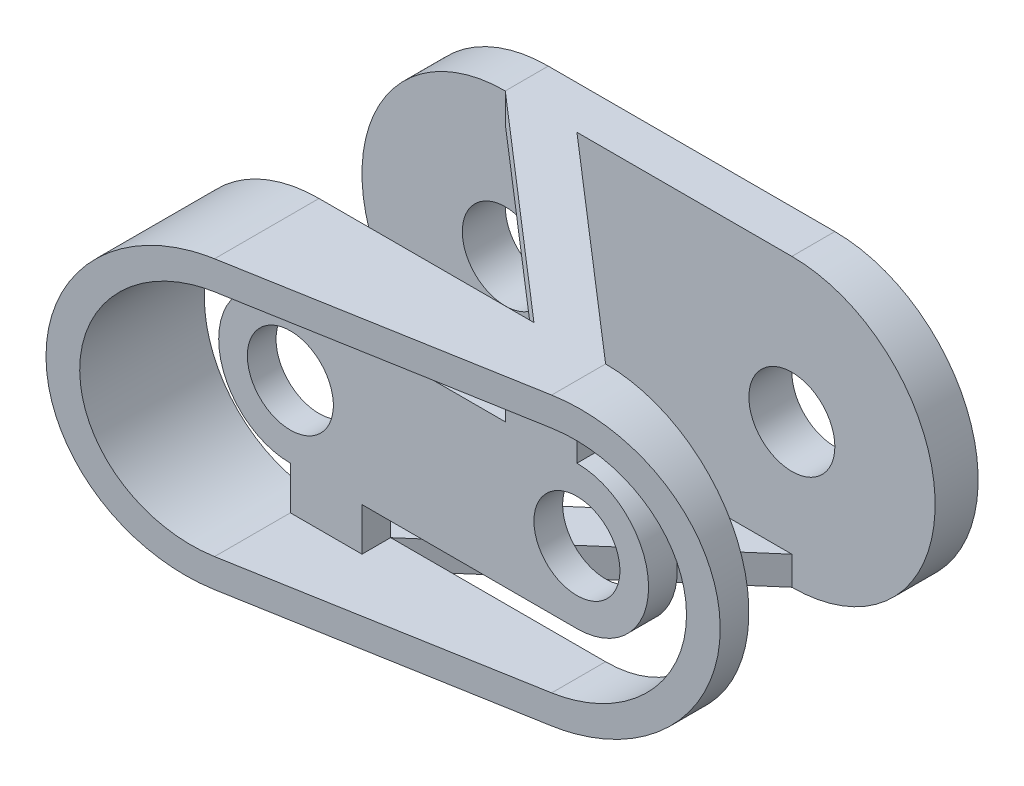
ISO-10303-21;
HEADER;
FILE_DESCRIPTION(('STEP AP214'),'2;1');
FILE_NAME('part.step','',(''),(''),'','','');
FILE_SCHEMA(('AUTOMOTIVE_DESIGN { 1 0 10303 214 1 1 1 1 }'));
ENDSEC;
DATA;
#1=APPLICATION_CONTEXT('core data for automotive mechanical design processes');
#2=APPLICATION_PROTOCOL_DEFINITION('international standard','automotive_design',2000,#1);
#3=PRODUCT_CONTEXT('',#1,'mechanical');
#4=PRODUCT('Part','Part','',(#3));
#5=PRODUCT_RELATED_PRODUCT_CATEGORY('part','',(#4));
#6=PRODUCT_DEFINITION_FORMATION('','',#4);
#7=PRODUCT_DEFINITION_CONTEXT('part definition',#1,'design');
#8=PRODUCT_DEFINITION('design','',#6,#7);
#9=PRODUCT_DEFINITION_SHAPE('','',#8);
#10=(LENGTH_UNIT() NAMED_UNIT(*) SI_UNIT(.MILLI.,.METRE.));
#11=(NAMED_UNIT(*) PLANE_ANGLE_UNIT() SI_UNIT($,.RADIAN.));
#12=(NAMED_UNIT(*) SI_UNIT($,.STERADIAN.) SOLID_ANGLE_UNIT());
#13=UNCERTAINTY_MEASURE_WITH_UNIT(LENGTH_MEASURE(1.E-05),#10,'distance_accuracy_value','');
#14=(GEOMETRIC_REPRESENTATION_CONTEXT(3) GLOBAL_UNCERTAINTY_ASSIGNED_CONTEXT((#13)) GLOBAL_UNIT_ASSIGNED_CONTEXT((#10,
#11,#12)) REPRESENTATION_CONTEXT('',''));
#15=CARTESIAN_POINT('',(0.,0.,0.));
#16=DIRECTION('',(0.,0.,1.));
#17=DIRECTION('',(1.,0.,0.));
#18=AXIS2_PLACEMENT_3D('',#15,#16,#17);
#19=CARTESIAN_POINT('',(50.,0.,80.));
#20=DIRECTION('',(0.,0.,1.));
#21=DIRECTION('',(1.,0.,0.));
#22=AXIS2_PLACEMENT_3D('',#19,#20,#21);
#23=PLANE('',#22);
#24=CARTESIAN_POINT('',(50.,0.,80.));
#25=DIRECTION('',(0.,0.,-1.));
#26=DIRECTION('',(-1.,0.,0.));
#27=AXIS2_PLACEMENT_3D('',#24,#25,#26);
#28=CIRCLE('',#27,40.);
#29=CARTESIAN_POINT('',(50.,40.,80.));
#30=VERTEX_POINT('',#29);
#31=CARTESIAN_POINT('',(50.,-40.,80.));
#32=VERTEX_POINT('',#31);
#33=EDGE_CURVE('E278',#30,#32,#28,.T.);
#34=ORIENTED_EDGE('',*,*,#33,.F.);
#35=DIRECTION('',(0.,1.,0.));
#36=VECTOR('',#35,1.);
#37=CARTESIAN_POINT('',(50.,40.,80.));
#38=LINE('',#37,#36);
#39=CARTESIAN_POINT('',(50.,50.,80.));
#40=VERTEX_POINT('',#39);
#41=EDGE_CURVE('E228',#30,#40,#38,.T.);
#42=ORIENTED_EDGE('',*,*,#41,.T.);
#43=CARTESIAN_POINT('',(50.,0.,80.));
#44=DIRECTION('',(0.,0.,1.));
#45=DIRECTION('',(1.,0.,0.));
#46=AXIS2_PLACEMENT_3D('',#43,#44,#45);
#47=CIRCLE('',#46,50.);
#48=CARTESIAN_POINT('',(50.,-50.,80.));
#49=VERTEX_POINT('',#48);
#50=EDGE_CURVE('E321',#49,#40,#47,.T.);
#51=ORIENTED_EDGE('',*,*,#50,.F.);
#52=DIRECTION('',(-1.,0.,0.));
#53=VECTOR('',#52,1.);
#54=CARTESIAN_POINT('',(50.,-50.,80.));
#55=LINE('',#54,#53);
#56=CARTESIAN_POINT('',(-25.,-50.,80.));
#57=VERTEX_POINT('',#56);
#58=EDGE_CURVE('E328',#49,#57,#55,.T.);
#59=ORIENTED_EDGE('',*,*,#58,.T.);
#60=DIRECTION('',(0.,-1.,0.));
#61=VECTOR('',#60,1.);
#62=CARTESIAN_POINT('',(-25.,-40.,80.));
#63=LINE('',#62,#61);
#64=CARTESIAN_POINT('',(-25.,-40.,80.));
#65=VERTEX_POINT('',#64);
#66=EDGE_CURVE('E376',#65,#57,#63,.T.);
#67=ORIENTED_EDGE('',*,*,#66,.F.);
#68=DIRECTION('',(-1.,0.,0.));
#69=VECTOR('',#68,1.);
#70=CARTESIAN_POINT('',(-50.,-40.,80.));
#71=LINE('',#70,#69);
#72=EDGE_CURVE('E298',#32,#65,#71,.T.);
#73=ORIENTED_EDGE('',*,*,#72,.F.);
#74=EDGE_LOOP('',(#34,#42,#51,#59,#67,#73));
#75=FACE_BOUND('',#74,.T.);
#76=ADVANCED_FACE('F33',(#75),#23,.F.);
#77=DIRECTION('',(-1.,0.,0.));
#78=VECTOR('',#77,1.);
#79=CARTESIAN_POINT('',(50.,50.,80.));
#80=LINE('',#79,#78);
#81=CARTESIAN_POINT('',(25.,50.,80.));
#82=VERTEX_POINT('',#81);
#83=CARTESIAN_POINT('',(-50.,50.,80.));
#84=VERTEX_POINT('',#83);
#85=EDGE_CURVE('E227',#82,#84,#80,.T.);
#86=ORIENTED_EDGE('',*,*,#85,.F.);
#87=DIRECTION('',(0.,1.,0.));
#88=VECTOR('',#87,1.);
#89=CARTESIAN_POINT('',(25.,40.,80.));
#90=LINE('',#89,#88);
#91=CARTESIAN_POINT('',(25.,40.,80.));
#92=VERTEX_POINT('',#91);
#93=EDGE_CURVE('E204',#92,#82,#90,.T.);
#94=ORIENTED_EDGE('',*,*,#93,.F.);
#95=DIRECTION('',(1.,0.,0.));
#96=VECTOR('',#95,1.);
#97=CARTESIAN_POINT('',(-50.,40.,80.));
#98=LINE('',#97,#96);
#99=CARTESIAN_POINT('',(-50.,40.,80.));
#100=VERTEX_POINT('',#99);
#101=EDGE_CURVE('E225',#100,#92,#98,.T.);
#102=ORIENTED_EDGE('',*,*,#101,.F.);
#103=CARTESIAN_POINT('',(-50.,0.,80.));
#104=DIRECTION('',(0.,0.,-1.));
#105=DIRECTION('',(-1.,0.,0.));
#106=AXIS2_PLACEMENT_3D('',#103,#104,#105);
#107=CIRCLE('',#106,40.);
#108=CARTESIAN_POINT('',(-50.,-40.,80.));
#109=VERTEX_POINT('',#108);
#110=EDGE_CURVE('E239',#109,#100,#107,.T.);
#111=ORIENTED_EDGE('',*,*,#110,.F.);
#112=DIRECTION('',(0.,-1.,0.));
#113=VECTOR('',#112,1.);
#114=CARTESIAN_POINT('',(-50.,-40.,80.));
#115=LINE('',#114,#113);
#116=CARTESIAN_POINT('',(-50.,-50.,80.));
#117=VERTEX_POINT('',#116);
#118=EDGE_CURVE('E372',#109,#117,#115,.T.);
#119=ORIENTED_EDGE('',*,*,#118,.T.);
#120=CARTESIAN_POINT('',(-50.,0.,80.));
#121=DIRECTION('',(0.,0.,1.));
#122=DIRECTION('',(1.,0.,0.));
#123=AXIS2_PLACEMENT_3D('',#120,#121,#122);
#124=CIRCLE('',#123,50.);
#125=EDGE_CURVE('E325',#84,#117,#124,.T.);
#126=ORIENTED_EDGE('',*,*,#125,.F.);
#127=EDGE_LOOP('',(#86,#94,#102,#111,#119,#126));
#128=FACE_BOUND('',#127,.T.);
#129=ADVANCED_FACE('F223',(#128),#23,.F.);
#130=CARTESIAN_POINT('',(-50.,0.,15.));
#131=DIRECTION('',(0.,0.,1.));
#132=DIRECTION('',(1.,0.,0.));
#133=AXIS2_PLACEMENT_3D('',#130,#131,#132);
#134=PLANE('',#133);
#135=DIRECTION('',(0.,1.,0.));
#136=VECTOR('',#135,1.);
#137=CARTESIAN_POINT('',(-25.,40.,15.));
#138=LINE('',#137,#136);
#139=CARTESIAN_POINT('',(-25.,40.,15.));
#140=VERTEX_POINT('',#139);
#141=CARTESIAN_POINT('',(-25.,50.,15.));
#142=VERTEX_POINT('',#141);
#143=EDGE_CURVE('E48',#140,#142,#138,.T.);
#144=ORIENTED_EDGE('',*,*,#143,.F.);
#145=DIRECTION('',(-1.,0.,0.));
#146=VECTOR('',#145,1.);
#147=CARTESIAN_POINT('',(-50.,40.,15.));
#148=LINE('',#147,#146);
#149=CARTESIAN_POINT('',(-50.,40.,15.));
#150=VERTEX_POINT('',#149);
#151=EDGE_CURVE('E52',#140,#150,#148,.T.);
#152=ORIENTED_EDGE('',*,*,#151,.T.);
#153=DIRECTION('',(0.,1.,0.));
#154=VECTOR('',#153,1.);
#155=CARTESIAN_POINT('',(-50.,40.,15.));
#156=LINE('',#155,#154);
#157=CARTESIAN_POINT('',(-50.,50.,15.));
#158=VERTEX_POINT('',#157);
#159=EDGE_CURVE('E206',#150,#158,#156,.T.);
#160=ORIENTED_EDGE('',*,*,#159,.T.);
#161=CARTESIAN_POINT('',(-50.,0.,15.));
#162=DIRECTION('',(0.,0.,1.));
#163=DIRECTION('',(1.,0.,0.));
#164=AXIS2_PLACEMENT_3D('',#161,#162,#163);
#165=CIRCLE('',#164,50.);
#166=CARTESIAN_POINT('',(-50.,-50.,15.));
#167=VERTEX_POINT('',#166);
#168=EDGE_CURVE('E394',#158,#167,#165,.T.);
#169=ORIENTED_EDGE('',*,*,#168,.T.);
#170=DIRECTION('',(1.,0.,0.));
#171=VECTOR('',#170,1.);
#172=CARTESIAN_POINT('',(50.,-50.,15.));
#173=LINE('',#172,#171);
#174=CARTESIAN_POINT('',(25.,-50.,15.));
#175=VERTEX_POINT('',#174);
#176=EDGE_CURVE('E397',#167,#175,#173,.T.);
#177=ORIENTED_EDGE('',*,*,#176,.T.);
#178=DIRECTION('',(0.,-1.,0.));
#179=VECTOR('',#178,1.);
#180=CARTESIAN_POINT('',(25.,-40.,15.));
#181=LINE('',#180,#179);
#182=CARTESIAN_POINT('',(25.,-40.,15.));
#183=VERTEX_POINT('',#182);
#184=EDGE_CURVE('E367',#183,#175,#181,.T.);
#185=ORIENTED_EDGE('',*,*,#184,.F.);
#186=DIRECTION('',(1.,0.,0.));
#187=VECTOR('',#186,1.);
#188=CARTESIAN_POINT('',(50.,-40.,15.));
#189=LINE('',#188,#187);
#190=CARTESIAN_POINT('',(50.,-40.,15.));
#191=VERTEX_POINT('',#190);
#192=EDGE_CURVE('E358',#183,#191,#189,.T.);
#193=ORIENTED_EDGE('',*,*,#192,.T.);
#194=DIRECTION('',(0.,-1.,0.));
#195=VECTOR('',#194,1.);
#196=CARTESIAN_POINT('',(50.,-40.,15.));
#197=LINE('',#196,#195);
#198=CARTESIAN_POINT('',(50.,-50.,15.));
#199=VERTEX_POINT('',#198);
#200=EDGE_CURVE('E378',#191,#199,#197,.T.);
#201=ORIENTED_EDGE('',*,*,#200,.T.);
#202=CARTESIAN_POINT('',(50.,0.,15.));
#203=DIRECTION('',(0.,0.,1.));
#204=DIRECTION('',(1.,0.,0.));
#205=AXIS2_PLACEMENT_3D('',#202,#203,#204);
#206=CIRCLE('',#205,50.);
#207=CARTESIAN_POINT('',(50.,50.,15.));
#208=VERTEX_POINT('',#207);
#209=EDGE_CURVE('E401',#199,#208,#206,.T.);
#210=ORIENTED_EDGE('',*,*,#209,.T.);
#211=DIRECTION('',(-1.,0.,0.));
#212=VECTOR('',#211,1.);
#213=CARTESIAN_POINT('',(50.,50.,15.));
#214=LINE('',#213,#212);
#215=EDGE_CURVE('E403',#208,#142,#214,.T.);
#216=ORIENTED_EDGE('',*,*,#215,.T.);
#217=EDGE_LOOP('',(#144,#152,#160,#169,#177,#185,#193,#201,#210,#216));
#218=FACE_BOUND('',#217,.T.);
#219=CARTESIAN_POINT('',(-50.,0.,15.));
#220=DIRECTION('',(0.,0.,1.));
#221=DIRECTION('',(1.,0.,0.));
#222=AXIS2_PLACEMENT_3D('',#219,#220,#221);
#223=CIRCLE('',#222,15.);
#224=CARTESIAN_POINT('',(-35.,0.,15.));
#225=VERTEX_POINT('',#224);
#226=EDGE_CURVE('E388',#225,#225,#223,.T.);
#227=ORIENTED_EDGE('',*,*,#226,.F.);
#228=EDGE_LOOP('',(#227));
#229=FACE_BOUND('',#228,.T.);
#230=CARTESIAN_POINT('',(50.,0.,15.));
#231=DIRECTION('',(0.,0.,1.));
#232=DIRECTION('',(1.,0.,0.));
#233=AXIS2_PLACEMENT_3D('',#230,#231,#232);
#234=CIRCLE('',#233,15.);
#235=CARTESIAN_POINT('',(65.,0.,15.));
#236=VERTEX_POINT('',#235);
#237=EDGE_CURVE('E382',#236,#236,#234,.T.);
#238=ORIENTED_EDGE('',*,*,#237,.F.);
#239=EDGE_LOOP('',(#238));
#240=FACE_BOUND('',#239,.T.);
#241=ADVANCED_FACE('F436',(#218,#229,#240),#134,.T.);
#242=CARTESIAN_POINT('',(-50.,0.,0.));
#243=DIRECTION('',(0.,0.,1.));
#244=DIRECTION('',(1.,0.,0.));
#245=AXIS2_PLACEMENT_3D('',#242,#243,#244);
#246=PLANE('',#245);
#247=CARTESIAN_POINT('',(-50.,0.,0.));
#248=DIRECTION('',(0.,0.,1.));
#249=DIRECTION('',(1.,0.,0.));
#250=AXIS2_PLACEMENT_3D('',#247,#248,#249);
#251=CIRCLE('',#250,50.);
#252=CARTESIAN_POINT('',(-50.,50.,0.));
#253=VERTEX_POINT('',#252);
#254=CARTESIAN_POINT('',(-50.,-50.,0.));
#255=VERTEX_POINT('',#254);
#256=EDGE_CURVE('E391',#253,#255,#251,.T.);
#257=ORIENTED_EDGE('',*,*,#256,.F.);
#258=DIRECTION('',(-1.,0.,0.));
#259=VECTOR('',#258,1.);
#260=CARTESIAN_POINT('',(50.,50.,0.));
#261=LINE('',#260,#259);
#262=CARTESIAN_POINT('',(50.,50.,0.));
#263=VERTEX_POINT('',#262);
#264=EDGE_CURVE('E398',#263,#253,#261,.T.);
#265=ORIENTED_EDGE('',*,*,#264,.F.);
#266=CARTESIAN_POINT('',(50.,0.,0.));
#267=DIRECTION('',(0.,0.,1.));
#268=DIRECTION('',(1.,0.,0.));
#269=AXIS2_PLACEMENT_3D('',#266,#267,#268);
#270=CIRCLE('',#269,50.);
#271=CARTESIAN_POINT('',(50.,-50.,0.));
#272=VERTEX_POINT('',#271);
#273=EDGE_CURVE('E410',#272,#263,#270,.T.);
#274=ORIENTED_EDGE('',*,*,#273,.F.);
#275=DIRECTION('',(1.,0.,0.));
#276=VECTOR('',#275,1.);
#277=CARTESIAN_POINT('',(50.,-50.,0.));
#278=LINE('',#277,#276);
#279=EDGE_CURVE('E408',#255,#272,#278,.T.);
#280=ORIENTED_EDGE('',*,*,#279,.F.);
#281=EDGE_LOOP('',(#257,#265,#274,#280));
#282=FACE_BOUND('',#281,.T.);
#283=CARTESIAN_POINT('',(-50.,0.,0.));
#284=DIRECTION('',(0.,0.,1.));
#285=DIRECTION('',(1.,0.,0.));
#286=AXIS2_PLACEMENT_3D('',#283,#284,#285);
#287=CIRCLE('',#286,15.);
#288=CARTESIAN_POINT('',(-35.,0.,0.));
#289=VERTEX_POINT('',#288);
#290=EDGE_CURVE('E385',#289,#289,#287,.T.);
#291=ORIENTED_EDGE('',*,*,#290,.T.);
#292=EDGE_LOOP('',(#291));
#293=FACE_BOUND('',#292,.T.);
#294=CARTESIAN_POINT('',(50.,0.,0.));
#295=DIRECTION('',(0.,0.,1.));
#296=DIRECTION('',(1.,0.,0.));
#297=AXIS2_PLACEMENT_3D('',#294,#295,#296);
#298=CIRCLE('',#297,15.);
#299=CARTESIAN_POINT('',(65.,0.,0.));
#300=VERTEX_POINT('',#299);
#301=EDGE_CURVE('E375',#300,#300,#298,.T.);
#302=ORIENTED_EDGE('',*,*,#301,.T.);
#303=EDGE_LOOP('',(#302));
#304=FACE_BOUND('',#303,.T.);
#305=ADVANCED_FACE('F428',(#282,#293,#304),#246,.F.);
#306=CARTESIAN_POINT('',(-50.,0.,15.));
#307=DIRECTION('',(0.,0.,-1.));
#308=DIRECTION('',(-1.,0.,0.));
#309=AXIS2_PLACEMENT_3D('',#306,#307,#308);
#310=CYLINDRICAL_SURFACE('',#309,50.);
#311=ORIENTED_EDGE('',*,*,#256,.T.);
#312=DIRECTION('',(0.,0.,-1.));
#313=VECTOR('',#312,1.);
#314=CARTESIAN_POINT('',(-50.,-50.,15.));
#315=LINE('',#314,#313);
#316=EDGE_CURVE('E11',#167,#255,#315,.T.);
#317=ORIENTED_EDGE('',*,*,#316,.F.);
#318=ORIENTED_EDGE('',*,*,#168,.F.);
#319=DIRECTION('',(0.,0.,-1.));
#320=VECTOR('',#319,1.);
#321=CARTESIAN_POINT('',(-50.,50.,15.));
#322=LINE('',#321,#320);
#323=EDGE_CURVE('E405',#158,#253,#322,.T.);
#324=ORIENTED_EDGE('',*,*,#323,.T.);
#325=EDGE_LOOP('',(#311,#317,#318,#324));
#326=FACE_BOUND('',#325,.T.);
#327=ADVANCED_FACE('F35',(#326),#310,.T.);
#328=CARTESIAN_POINT('',(50.,-50.,15.));
#329=DIRECTION('',(0.,1.,0.));
#330=DIRECTION('',(-1.,0.,0.));
#331=AXIS2_PLACEMENT_3D('',#328,#329,#330);
#332=PLANE('',#331);
#333=ORIENTED_EDGE('',*,*,#279,.T.);
#334=DIRECTION('',(0.,0.,-1.));
#335=VECTOR('',#334,1.);
#336=CARTESIAN_POINT('',(50.,-50.,15.));
#337=LINE('',#336,#335);
#338=EDGE_CURVE('E41',#199,#272,#337,.T.);
#339=ORIENTED_EDGE('',*,*,#338,.F.);
#340=DIRECTION('',(-0.755689082789818,0.,0.654930538417842));
#341=VECTOR('',#340,1.);
#342=CARTESIAN_POINT('',(-25.,-50.,80.));
#343=LINE('',#342,#341);
#344=EDGE_CURVE('E359',#199,#57,#343,.T.);
#345=ORIENTED_EDGE('',*,*,#344,.T.);
#346=ORIENTED_EDGE('',*,*,#58,.F.);
#347=DIRECTION('',(0.,0.,-1.));
#348=VECTOR('',#347,1.);
#349=CARTESIAN_POINT('',(50.,-50.,150.));
#350=LINE('',#349,#348);
#351=CARTESIAN_POINT('',(50.,-50.,98.8163490354229));
#352=VERTEX_POINT('',#351);
#353=EDGE_CURVE('E331',#352,#49,#350,.T.);
#354=ORIENTED_EDGE('',*,*,#353,.F.);
#355=DIRECTION('',(-0.984807753012209,0.,0.173648177666924));
#356=VECTOR('',#355,1.);
#357=CARTESIAN_POINT('',(100.,-50.,90.));
#358=LINE('',#357,#356);
#359=CARTESIAN_POINT('',(-50.,-50.,116.449047106269));
#360=VERTEX_POINT('',#359);
#361=EDGE_CURVE('E314',#352,#360,#358,.T.);
#362=ORIENTED_EDGE('',*,*,#361,.T.);
#363=DIRECTION('',(0.,0.,-1.));
#364=VECTOR('',#363,1.);
#365=CARTESIAN_POINT('',(-50.,-50.,150.));
#366=LINE('',#365,#364);
#367=EDGE_CURVE('E333',#360,#117,#366,.T.);
#368=ORIENTED_EDGE('',*,*,#367,.T.);
#369=DIRECTION('',(0.755689082789818,0.,-0.654930538417842));
#370=VECTOR('',#369,1.);
#371=CARTESIAN_POINT('',(-50.,-50.,80.));
#372=LINE('',#371,#370);
#373=EDGE_CURVE('E354',#117,#175,#372,.T.);
#374=ORIENTED_EDGE('',*,*,#373,.T.);
#375=ORIENTED_EDGE('',*,*,#176,.F.);
#376=ORIENTED_EDGE('',*,*,#316,.T.);
#377=EDGE_LOOP('',(#333,#339,#345,#346,#354,#362,#368,#374,#375,#376));
#378=FACE_BOUND('',#377,.T.);
#379=ADVANCED_FACE('F537',(#378),#332,.F.);
#380=CARTESIAN_POINT('',(50.,0.,15.));
#381=DIRECTION('',(0.,0.,-1.));
#382=DIRECTION('',(-1.,0.,0.));
#383=AXIS2_PLACEMENT_3D('',#380,#381,#382);
#384=CYLINDRICAL_SURFACE('',#383,50.);
#385=ORIENTED_EDGE('',*,*,#273,.T.);
#386=DIRECTION('',(0.,0.,-1.));
#387=VECTOR('',#386,1.);
#388=CARTESIAN_POINT('',(50.,50.,15.));
#389=LINE('',#388,#387);
#390=EDGE_CURVE('E415',#208,#263,#389,.T.);
#391=ORIENTED_EDGE('',*,*,#390,.F.);
#392=ORIENTED_EDGE('',*,*,#209,.F.);
#393=ORIENTED_EDGE('',*,*,#338,.T.);
#394=EDGE_LOOP('',(#385,#391,#392,#393));
#395=FACE_BOUND('',#394,.T.);
#396=ADVANCED_FACE('F422',(#395),#384,.T.);
#397=CARTESIAN_POINT('',(50.,50.,15.));
#398=DIRECTION('',(0.,-1.,0.));
#399=DIRECTION('',(1.,0.,0.));
#400=AXIS2_PLACEMENT_3D('',#397,#398,#399);
#401=PLANE('',#400);
#402=ORIENTED_EDGE('',*,*,#264,.T.);
#403=ORIENTED_EDGE('',*,*,#323,.F.);
#404=DIRECTION('',(0.755689082789818,0.,0.654930538417842));
#405=VECTOR('',#404,1.);
#406=CARTESIAN_POINT('',(-50.,50.,15.));
#407=LINE('',#406,#405);
#408=EDGE_CURVE('E440',#158,#82,#407,.T.);
#409=ORIENTED_EDGE('',*,*,#408,.T.);
#410=ORIENTED_EDGE('',*,*,#85,.T.);
#411=DIRECTION('',(0.,0.,-1.));
#412=VECTOR('',#411,1.);
#413=CARTESIAN_POINT('',(-50.,50.,150.));
#414=LINE('',#413,#412);
#415=CARTESIAN_POINT('',(-50.,50.,116.449047106269));
#416=VERTEX_POINT('',#415);
#417=EDGE_CURVE('E336',#416,#84,#414,.T.);
#418=ORIENTED_EDGE('',*,*,#417,.F.);
#419=DIRECTION('',(-0.984807753012209,0.,0.173648177666924));
#420=VECTOR('',#419,1.);
#421=CARTESIAN_POINT('',(100.,50.,90.));
#422=LINE('',#421,#420);
#423=CARTESIAN_POINT('',(50.,50.,98.8163490354229));
#424=VERTEX_POINT('',#423);
#425=EDGE_CURVE('E305',#424,#416,#422,.T.);
#426=ORIENTED_EDGE('',*,*,#425,.F.);
#427=DIRECTION('',(0.,0.,-1.));
#428=VECTOR('',#427,1.);
#429=CARTESIAN_POINT('',(50.,50.,150.));
#430=LINE('',#429,#428);
#431=EDGE_CURVE('E339',#424,#40,#430,.T.);
#432=ORIENTED_EDGE('',*,*,#431,.T.);
#433=DIRECTION('',(-0.755689082789818,0.,-0.654930538417842));
#434=VECTOR('',#433,1.);
#435=CARTESIAN_POINT('',(50.,50.,80.));
#436=LINE('',#435,#434);
#437=EDGE_CURVE('E441',#40,#142,#436,.T.);
#438=ORIENTED_EDGE('',*,*,#437,.T.);
#439=ORIENTED_EDGE('',*,*,#215,.F.);
#440=ORIENTED_EDGE('',*,*,#390,.T.);
#441=EDGE_LOOP('',(#402,#403,#409,#410,#418,#426,#432,#438,#439,#440));
#442=FACE_BOUND('',#441,.T.);
#443=ADVANCED_FACE('F432',(#442),#401,.F.);
#444=CARTESIAN_POINT('',(-50.,0.,15.));
#445=DIRECTION('',(0.,0.,-1.));
#446=DIRECTION('',(-1.,0.,0.));
#447=AXIS2_PLACEMENT_3D('',#444,#445,#446);
#448=CYLINDRICAL_SURFACE('',#447,15.);
#449=ORIENTED_EDGE('',*,*,#226,.T.);
#450=EDGE_LOOP('',(#449));
#451=FACE_BOUND('',#450,.T.);
#452=ORIENTED_EDGE('',*,*,#290,.F.);
#453=EDGE_LOOP('',(#452));
#454=FACE_BOUND('',#453,.T.);
#455=ADVANCED_FACE('F714',(#451,#454),#448,.F.);
#456=CARTESIAN_POINT('',(50.,0.,15.));
#457=DIRECTION('',(0.,0.,-1.));
#458=DIRECTION('',(-1.,0.,0.));
#459=AXIS2_PLACEMENT_3D('',#456,#457,#458);
#460=CYLINDRICAL_SURFACE('',#459,15.);
#461=ORIENTED_EDGE('',*,*,#237,.T.);
#462=EDGE_LOOP('',(#461));
#463=FACE_BOUND('',#462,.T.);
#464=ORIENTED_EDGE('',*,*,#301,.F.);
#465=EDGE_LOOP('',(#464));
#466=FACE_BOUND('',#465,.T.);
#467=ADVANCED_FACE('F737',(#463,#466),#460,.F.);
#468=CARTESIAN_POINT('',(-50.,-40.,80.));
#469=DIRECTION('',(-0.654930538417842,0.,-0.755689082789818));
#470=DIRECTION('',(-0.755689082789818,0.,0.654930538417842));
#471=AXIS2_PLACEMENT_3D('',#468,#469,#470);
#472=PLANE('',#471);
#473=ORIENTED_EDGE('',*,*,#373,.F.);
#474=ORIENTED_EDGE('',*,*,#118,.F.);
#475=DIRECTION('',(0.755689082789818,0.,-0.654930538417842));
#476=VECTOR('',#475,1.);
#477=CARTESIAN_POINT('',(-50.,-40.,80.));
#478=LINE('',#477,#476);
#479=EDGE_CURVE('E355',#109,#183,#478,.T.);
#480=ORIENTED_EDGE('',*,*,#479,.T.);
#481=ORIENTED_EDGE('',*,*,#184,.T.);
#482=EDGE_LOOP('',(#473,#474,#480,#481));
#483=FACE_BOUND('',#482,.T.);
#484=ADVANCED_FACE('F552',(#483),#472,.T.);
#485=CARTESIAN_POINT('',(-25.,-40.,80.));
#486=DIRECTION('',(0.654930538417842,0.,0.755689082789818));
#487=DIRECTION('',(0.755689082789818,0.,-0.654930538417842));
#488=AXIS2_PLACEMENT_3D('',#485,#486,#487);
#489=PLANE('',#488);
#490=ORIENTED_EDGE('',*,*,#344,.F.);
#491=ORIENTED_EDGE('',*,*,#200,.F.);
#492=DIRECTION('',(-0.755689082789818,0.,0.654930538417842));
#493=VECTOR('',#492,1.);
#494=CARTESIAN_POINT('',(-25.,-40.,80.));
#495=LINE('',#494,#493);
#496=EDGE_CURVE('E362',#191,#65,#495,.T.);
#497=ORIENTED_EDGE('',*,*,#496,.T.);
#498=ORIENTED_EDGE('',*,*,#66,.T.);
#499=EDGE_LOOP('',(#490,#491,#497,#498));
#500=FACE_BOUND('',#499,.T.);
#501=ADVANCED_FACE('F536',(#500),#489,.T.);
#502=CARTESIAN_POINT('',(0.,-40.,0.));
#503=DIRECTION('',(0.,1.,0.));
#504=DIRECTION('',(-1.,0.,0.));
#505=AXIS2_PLACEMENT_3D('',#502,#503,#504);
#506=PLANE('',#505);
#507=ORIENTED_EDGE('',*,*,#479,.F.);
#508=DIRECTION('',(-1.,0.,0.));
#509=VECTOR('',#508,1.);
#510=CARTESIAN_POINT('',(-50.,-40.,80.));
#511=LINE('',#510,#509);
#512=EDGE_CURVE('E364',#65,#109,#511,.T.);
#513=ORIENTED_EDGE('',*,*,#512,.F.);
#514=ORIENTED_EDGE('',*,*,#496,.F.);
#515=ORIENTED_EDGE('',*,*,#192,.F.);
#516=EDGE_LOOP('',(#507,#513,#514,#515));
#517=FACE_BOUND('',#516,.T.);
#518=ADVANCED_FACE('F553',(#517),#506,.T.);
#519=CARTESIAN_POINT('',(50.,0.,80.));
#520=DIRECTION('',(0.,0.,-1.));
#521=DIRECTION('',(-1.,0.,0.));
#522=AXIS2_PLACEMENT_3D('',#519,#520,#521);
#523=CIRCLE('',#522,15.);
#524=CARTESIAN_POINT('',(35.,0.,80.));
#525=VERTEX_POINT('',#524);
#526=EDGE_CURVE('E454',#525,#525,#523,.T.);
#527=ORIENTED_EDGE('',*,*,#526,.F.);
#528=EDGE_LOOP('',(#527));
#529=FACE_BOUND('',#528,.T.);
#530=CARTESIAN_POINT('',(-50.,0.,80.));
#531=DIRECTION('',(0.,0.,-1.));
#532=DIRECTION('',(-1.,0.,0.));
#533=AXIS2_PLACEMENT_3D('',#530,#531,#532);
#534=CIRCLE('',#533,15.);
#535=CARTESIAN_POINT('',(-65.,0.,80.));
#536=VERTEX_POINT('',#535);
#537=EDGE_CURVE('E448',#536,#536,#534,.T.);
#538=ORIENTED_EDGE('',*,*,#537,.F.);
#539=EDGE_LOOP('',(#538));
#540=FACE_BOUND('',#539,.T.);
#541=DIRECTION('',(0.,1.,0.));
#542=VECTOR('',#541,1.);
#543=CARTESIAN_POINT('',(25.,40.,80.));
#544=LINE('',#543,#542);
#545=CARTESIAN_POINT('',(25.,25.,80.));
#546=VERTEX_POINT('',#545);
#547=EDGE_CURVE('E245',#546,#92,#544,.T.);
#548=ORIENTED_EDGE('',*,*,#547,.T.);
#549=DIRECTION('',(1.,0.,0.));
#550=VECTOR('',#549,1.);
#551=CARTESIAN_POINT('',(50.,40.,80.));
#552=LINE('',#551,#550);
#553=EDGE_CURVE('E208',#92,#30,#552,.T.);
#554=ORIENTED_EDGE('',*,*,#553,.T.);
#555=DIRECTION('',(0.,-1.,0.));
#556=VECTOR('',#555,1.);
#557=CARTESIAN_POINT('',(50.,25.,80.));
#558=LINE('',#557,#556);
#559=CARTESIAN_POINT('',(50.,25.,80.));
#560=VERTEX_POINT('',#559);
#561=EDGE_CURVE('E256',#30,#560,#558,.T.);
#562=ORIENTED_EDGE('',*,*,#561,.T.);
#563=CARTESIAN_POINT('',(50.,0.,80.));
#564=DIRECTION('',(0.,0.,-1.));
#565=DIRECTION('',(-1.,0.,0.));
#566=AXIS2_PLACEMENT_3D('',#563,#564,#565);
#567=CIRCLE('',#566,25.);
#568=CARTESIAN_POINT('',(50.,-25.,80.));
#569=VERTEX_POINT('',#568);
#570=EDGE_CURVE('E258',#560,#569,#567,.T.);
#571=ORIENTED_EDGE('',*,*,#570,.T.);
#572=DIRECTION('',(-1.,0.,0.));
#573=VECTOR('',#572,1.);
#574=CARTESIAN_POINT('',(50.,-25.,80.));
#575=LINE('',#574,#573);
#576=CARTESIAN_POINT('',(-25.,-25.,80.));
#577=VERTEX_POINT('',#576);
#578=EDGE_CURVE('E266',#569,#577,#575,.T.);
#579=ORIENTED_EDGE('',*,*,#578,.T.);
#580=DIRECTION('',(0.,-1.,0.));
#581=VECTOR('',#580,1.);
#582=CARTESIAN_POINT('',(-25.,-25.,80.));
#583=LINE('',#582,#581);
#584=EDGE_CURVE('E269',#577,#65,#583,.T.);
#585=ORIENTED_EDGE('',*,*,#584,.T.);
#586=ORIENTED_EDGE('',*,*,#512,.T.);
#587=DIRECTION('',(0.,1.,0.));
#588=VECTOR('',#587,1.);
#589=CARTESIAN_POINT('',(-50.,-40.,80.));
#590=LINE('',#589,#588);
#591=CARTESIAN_POINT('',(-50.,-25.,80.));
#592=VERTEX_POINT('',#591);
#593=EDGE_CURVE('E272',#109,#592,#590,.T.);
#594=ORIENTED_EDGE('',*,*,#593,.T.);
#595=CARTESIAN_POINT('',(-50.,0.,80.));
#596=DIRECTION('',(0.,0.,-1.));
#597=DIRECTION('',(-1.,0.,0.));
#598=AXIS2_PLACEMENT_3D('',#595,#596,#597);
#599=CIRCLE('',#598,25.);
#600=CARTESIAN_POINT('',(-50.,25.,80.));
#601=VERTEX_POINT('',#600);
#602=EDGE_CURVE('E260',#592,#601,#599,.T.);
#603=ORIENTED_EDGE('',*,*,#602,.T.);
#604=DIRECTION('',(1.,0.,0.));
#605=VECTOR('',#604,1.);
#606=CARTESIAN_POINT('',(25.,25.,80.));
#607=LINE('',#606,#605);
#608=EDGE_CURVE('E255',#601,#546,#607,.T.);
#609=ORIENTED_EDGE('',*,*,#608,.T.);
#610=EDGE_LOOP('',(#548,#554,#562,#571,#579,#585,#586,#594,#603,#609));
#611=FACE_BOUND('',#610,.T.);
#612=ADVANCED_FACE('F252',(#529,#540,#611),#23,.F.);
#613=CARTESIAN_POINT('',(50.,0.,150.));
#614=DIRECTION('',(0.,0.,-1.));
#615=DIRECTION('',(-1.,0.,0.));
#616=AXIS2_PLACEMENT_3D('',#613,#614,#615);
#617=CYLINDRICAL_SURFACE('',#616,50.);
#618=CARTESIAN_POINT('',(50.,0.,98.8163490354229));
#619=DIRECTION('',(-0.173648177666924,0.,-0.984807753012209));
#620=DIRECTION('',(0.984807753012209,0.,-0.173648177666924));
#621=AXIS2_PLACEMENT_3D('',#618,#619,#620);
#622=ELLIPSE('',#621,50.7713305942872,50.);
#623=EDGE_CURVE('E319',#424,#352,#622,.T.);
#624=ORIENTED_EDGE('',*,*,#623,.T.);
#625=ORIENTED_EDGE('',*,*,#353,.T.);
#626=ORIENTED_EDGE('',*,*,#50,.T.);
#627=ORIENTED_EDGE('',*,*,#431,.F.);
#628=EDGE_LOOP('',(#624,#625,#626,#627));
#629=FACE_BOUND('',#628,.T.);
#630=ADVANCED_FACE('F542',(#629),#617,.T.);
#631=CARTESIAN_POINT('',(-50.,0.,150.));
#632=DIRECTION('',(0.,0.,-1.));
#633=DIRECTION('',(-1.,0.,0.));
#634=AXIS2_PLACEMENT_3D('',#631,#632,#633);
#635=CYLINDRICAL_SURFACE('',#634,50.);
#636=ORIENTED_EDGE('',*,*,#367,.F.);
#637=CARTESIAN_POINT('',(-50.,0.,116.449047106269));
#638=DIRECTION('',(-0.173648177666924,0.,-0.984807753012209));
#639=DIRECTION('',(0.984807753012209,0.,-0.173648177666924));
#640=AXIS2_PLACEMENT_3D('',#637,#638,#639);
#641=ELLIPSE('',#640,50.7713305942872,50.);
#642=EDGE_CURVE('E317',#360,#416,#641,.T.);
#643=ORIENTED_EDGE('',*,*,#642,.T.);
#644=ORIENTED_EDGE('',*,*,#417,.T.);
#645=ORIENTED_EDGE('',*,*,#125,.T.);
#646=EDGE_LOOP('',(#636,#643,#644,#645));
#647=FACE_BOUND('',#646,.T.);
#648=ADVANCED_FACE('F550',(#647),#635,.T.);
#649=CARTESIAN_POINT('',(100.,-50.,90.));
#650=DIRECTION('',(-0.173648177666924,0.,-0.984807753012209));
#651=DIRECTION('',(-0.984807753012209,0.,0.173648177666924));
#652=AXIS2_PLACEMENT_3D('',#649,#650,#651);
#653=PLANE('',#652);
#654=DIRECTION('',(0.984807753012209,0.,-0.173648177666924));
#655=VECTOR('',#654,1.);
#656=CARTESIAN_POINT('',(100.,40.,90.));
#657=LINE('',#656,#655);
#658=CARTESIAN_POINT('',(-50.,40.,116.449047106269));
#659=VERTEX_POINT('',#658);
#660=CARTESIAN_POINT('',(50.,40.,98.8163490354229));
#661=VERTEX_POINT('',#660);
#662=EDGE_CURVE('E348',#659,#661,#657,.T.);
#663=ORIENTED_EDGE('',*,*,#662,.T.);
#664=CARTESIAN_POINT('',(50.,0.,98.8163490354229));
#665=DIRECTION('',(-0.173648177666924,0.,-0.984807753012209));
#666=DIRECTION('',(0.984807753012209,0.,-0.173648177666924));
#667=AXIS2_PLACEMENT_3D('',#664,#665,#666);
#668=ELLIPSE('',#667,40.6170644754297,40.);
#669=CARTESIAN_POINT('',(50.,-40.,98.8163490354229));
#670=VERTEX_POINT('',#669);
#671=EDGE_CURVE('E351',#661,#670,#668,.T.);
#672=ORIENTED_EDGE('',*,*,#671,.T.);
#673=DIRECTION('',(-0.984807753012209,0.,0.173648177666924));
#674=VECTOR('',#673,1.);
#675=CARTESIAN_POINT('',(100.,-40.,90.));
#676=LINE('',#675,#674);
#677=CARTESIAN_POINT('',(-50.,-40.,116.449047106269));
#678=VERTEX_POINT('',#677);
#679=EDGE_CURVE('E342',#670,#678,#676,.T.);
#680=ORIENTED_EDGE('',*,*,#679,.T.);
#681=CARTESIAN_POINT('',(-50.,0.,116.449047106269));
#682=DIRECTION('',(-0.173648177666924,0.,-0.984807753012209));
#683=DIRECTION('',(0.984807753012209,0.,-0.173648177666924));
#684=AXIS2_PLACEMENT_3D('',#681,#682,#683);
#685=ELLIPSE('',#684,40.6170644754297,40.);
#686=EDGE_CURVE('E345',#678,#659,#685,.T.);
#687=ORIENTED_EDGE('',*,*,#686,.T.);
#688=EDGE_LOOP('',(#663,#672,#680,#687));
#689=FACE_BOUND('',#688,.T.);
#690=ORIENTED_EDGE('',*,*,#623,.F.);
#691=ORIENTED_EDGE('',*,*,#425,.T.);
#692=ORIENTED_EDGE('',*,*,#642,.F.);
#693=ORIENTED_EDGE('',*,*,#361,.F.);
#694=EDGE_LOOP('',(#690,#691,#692,#693));
#695=FACE_BOUND('',#694,.T.);
#696=ADVANCED_FACE('F548',(#689,#695),#653,.F.);
#697=CARTESIAN_POINT('',(50.,0.,150.));
#698=DIRECTION('',(0.,0.,-1.));
#699=DIRECTION('',(-1.,0.,0.));
#700=AXIS2_PLACEMENT_3D('',#697,#698,#699);
#701=CYLINDRICAL_SURFACE('',#700,40.);
#702=DIRECTION('',(0.,0.,-1.));
#703=VECTOR('',#702,1.);
#704=CARTESIAN_POINT('',(50.,40.,150.));
#705=LINE('',#704,#703);
#706=CARTESIAN_POINT('',(50.,40.,90.));
#707=VERTEX_POINT('',#706);
#708=EDGE_CURVE('E302',#661,#707,#705,.T.);
#709=ORIENTED_EDGE('',*,*,#708,.T.);
#710=DIRECTION('',(0.,0.,-1.));
#711=VECTOR('',#710,1.);
#712=CARTESIAN_POINT('',(50.,40.,90.));
#713=LINE('',#712,#711);
#714=EDGE_CURVE('E249',#707,#30,#713,.T.);
#715=ORIENTED_EDGE('',*,*,#714,.T.);
#716=ORIENTED_EDGE('',*,*,#33,.T.);
#717=DIRECTION('',(0.,0.,-1.));
#718=VECTOR('',#717,1.);
#719=CARTESIAN_POINT('',(50.,-40.,150.));
#720=LINE('',#719,#718);
#721=EDGE_CURVE('E238',#670,#32,#720,.T.);
#722=ORIENTED_EDGE('',*,*,#721,.F.);
#723=ORIENTED_EDGE('',*,*,#671,.F.);
#724=EDGE_LOOP('',(#709,#715,#716,#722,#723));
#725=FACE_BOUND('',#724,.T.);
#726=ADVANCED_FACE('F500',(#725),#701,.F.);
#727=CARTESIAN_POINT('',(-50.,40.,150.));
#728=DIRECTION('',(0.,1.,0.));
#729=DIRECTION('',(-1.,0.,0.));
#730=AXIS2_PLACEMENT_3D('',#727,#728,#729);
#731=PLANE('',#730);
#732=ORIENTED_EDGE('',*,*,#101,.T.);
#733=DIRECTION('',(0.,0.,-1.));
#734=VECTOR('',#733,1.);
#735=CARTESIAN_POINT('',(25.,40.,90.));
#736=LINE('',#735,#734);
#737=CARTESIAN_POINT('',(25.,40.,90.));
#738=VERTEX_POINT('',#737);
#739=EDGE_CURVE('E233',#738,#92,#736,.T.);
#740=ORIENTED_EDGE('',*,*,#739,.F.);
#741=DIRECTION('',(1.,0.,0.));
#742=VECTOR('',#741,1.);
#743=CARTESIAN_POINT('',(50.,40.,90.));
#744=LINE('',#743,#742);
#745=EDGE_CURVE('E468',#738,#707,#744,.T.);
#746=ORIENTED_EDGE('',*,*,#745,.T.);
#747=ORIENTED_EDGE('',*,*,#708,.F.);
#748=ORIENTED_EDGE('',*,*,#662,.F.);
#749=DIRECTION('',(0.,0.,-1.));
#750=VECTOR('',#749,1.);
#751=CARTESIAN_POINT('',(-50.,40.,150.));
#752=LINE('',#751,#750);
#753=EDGE_CURVE('E236',#659,#100,#752,.T.);
#754=ORIENTED_EDGE('',*,*,#753,.T.);
#755=EDGE_LOOP('',(#732,#740,#746,#747,#748,#754));
#756=FACE_BOUND('',#755,.T.);
#757=ADVANCED_FACE('F232',(#756),#731,.F.);
#758=CARTESIAN_POINT('',(-50.,0.,150.));
#759=DIRECTION('',(0.,0.,-1.));
#760=DIRECTION('',(-1.,0.,0.));
#761=AXIS2_PLACEMENT_3D('',#758,#759,#760);
#762=CYLINDRICAL_SURFACE('',#761,40.);
#763=DIRECTION('',(0.,0.,-1.));
#764=VECTOR('',#763,1.);
#765=CARTESIAN_POINT('',(-50.,-40.,150.));
#766=LINE('',#765,#764);
#767=CARTESIAN_POINT('',(-50.,-40.,90.));
#768=VERTEX_POINT('',#767);
#769=EDGE_CURVE('E307',#678,#768,#766,.T.);
#770=ORIENTED_EDGE('',*,*,#769,.T.);
#771=DIRECTION('',(0.,0.,-1.));
#772=VECTOR('',#771,1.);
#773=CARTESIAN_POINT('',(-50.,-40.,90.));
#774=LINE('',#773,#772);
#775=EDGE_CURVE('E279',#768,#109,#774,.T.);
#776=ORIENTED_EDGE('',*,*,#775,.T.);
#777=ORIENTED_EDGE('',*,*,#110,.T.);
#778=ORIENTED_EDGE('',*,*,#753,.F.);
#779=ORIENTED_EDGE('',*,*,#686,.F.);
#780=EDGE_LOOP('',(#770,#776,#777,#778,#779));
#781=FACE_BOUND('',#780,.T.);
#782=ADVANCED_FACE('F523',(#781),#762,.F.);
#783=CARTESIAN_POINT('',(-50.,-40.,150.));
#784=DIRECTION('',(0.,-1.,0.));
#785=DIRECTION('',(1.,0.,0.));
#786=AXIS2_PLACEMENT_3D('',#783,#784,#785);
#787=PLANE('',#786);
#788=ORIENTED_EDGE('',*,*,#72,.T.);
#789=DIRECTION('',(0.,0.,-1.));
#790=VECTOR('',#789,1.);
#791=CARTESIAN_POINT('',(-25.,-40.,90.));
#792=LINE('',#791,#790);
#793=CARTESIAN_POINT('',(-25.,-40.,90.));
#794=VERTEX_POINT('',#793);
#795=EDGE_CURVE('E282',#794,#65,#792,.T.);
#796=ORIENTED_EDGE('',*,*,#795,.F.);
#797=DIRECTION('',(-1.,0.,0.));
#798=VECTOR('',#797,1.);
#799=CARTESIAN_POINT('',(-25.,-40.,90.));
#800=LINE('',#799,#798);
#801=EDGE_CURVE('E482',#794,#768,#800,.T.);
#802=ORIENTED_EDGE('',*,*,#801,.T.);
#803=ORIENTED_EDGE('',*,*,#769,.F.);
#804=ORIENTED_EDGE('',*,*,#679,.F.);
#805=ORIENTED_EDGE('',*,*,#721,.T.);
#806=EDGE_LOOP('',(#788,#796,#802,#803,#804,#805));
#807=FACE_BOUND('',#806,.T.);
#808=ADVANCED_FACE('F530',(#807),#787,.F.);
#809=CARTESIAN_POINT('',(-50.,0.,90.));
#810=DIRECTION('',(0.,0.,-1.));
#811=DIRECTION('',(-1.,0.,0.));
#812=AXIS2_PLACEMENT_3D('',#809,#810,#811);
#813=CYLINDRICAL_SURFACE('',#812,25.);
#814=ORIENTED_EDGE('',*,*,#602,.F.);
#815=DIRECTION('',(0.,0.,-1.));
#816=VECTOR('',#815,1.);
#817=CARTESIAN_POINT('',(-50.,-25.,90.));
#818=LINE('',#817,#816);
#819=CARTESIAN_POINT('',(-50.,-25.,90.));
#820=VERTEX_POINT('',#819);
#821=EDGE_CURVE('E276',#820,#592,#818,.T.);
#822=ORIENTED_EDGE('',*,*,#821,.F.);
#823=CARTESIAN_POINT('',(-50.,0.,90.));
#824=DIRECTION('',(0.,0.,-1.));
#825=DIRECTION('',(-1.,0.,0.));
#826=AXIS2_PLACEMENT_3D('',#823,#824,#825);
#827=CIRCLE('',#826,25.);
#828=CARTESIAN_POINT('',(-50.,25.,90.));
#829=VERTEX_POINT('',#828);
#830=EDGE_CURVE('E275',#820,#829,#827,.T.);
#831=ORIENTED_EDGE('',*,*,#830,.T.);
#832=DIRECTION('',(0.,0.,-1.));
#833=VECTOR('',#832,1.);
#834=CARTESIAN_POINT('',(-50.,25.,90.));
#835=LINE('',#834,#833);
#836=EDGE_CURVE('E294',#829,#601,#835,.T.);
#837=ORIENTED_EDGE('',*,*,#836,.T.);
#838=EDGE_LOOP('',(#814,#822,#831,#837));
#839=FACE_BOUND('',#838,.T.);
#840=ADVANCED_FACE('F488',(#839),#813,.T.);
#841=CARTESIAN_POINT('',(-50.,-40.,90.));
#842=DIRECTION('',(-1.,0.,0.));
#843=DIRECTION('',(0.,0.,1.));
#844=AXIS2_PLACEMENT_3D('',#841,#842,#843);
#845=PLANE('',#844);
#846=ORIENTED_EDGE('',*,*,#593,.F.);
#847=ORIENTED_EDGE('',*,*,#775,.F.);
#848=DIRECTION('',(0.,1.,0.));
#849=VECTOR('',#848,1.);
#850=CARTESIAN_POINT('',(-50.,-40.,90.));
#851=LINE('',#850,#849);
#852=EDGE_CURVE('E296',#768,#820,#851,.T.);
#853=ORIENTED_EDGE('',*,*,#852,.T.);
#854=ORIENTED_EDGE('',*,*,#821,.T.);
#855=EDGE_LOOP('',(#846,#847,#853,#854));
#856=FACE_BOUND('',#855,.T.);
#857=ADVANCED_FACE('F527',(#856),#845,.T.);
#858=CARTESIAN_POINT('',(-25.,-25.,90.));
#859=DIRECTION('',(1.,0.,0.));
#860=DIRECTION('',(0.,1.,0.));
#861=AXIS2_PLACEMENT_3D('',#858,#859,#860);
#862=PLANE('',#861);
#863=ORIENTED_EDGE('',*,*,#584,.F.);
#864=DIRECTION('',(0.,0.,-1.));
#865=VECTOR('',#864,1.);
#866=CARTESIAN_POINT('',(-25.,-25.,90.));
#867=LINE('',#866,#865);
#868=CARTESIAN_POINT('',(-25.,-25.,90.));
#869=VERTEX_POINT('',#868);
#870=EDGE_CURVE('E285',#869,#577,#867,.T.);
#871=ORIENTED_EDGE('',*,*,#870,.F.);
#872=DIRECTION('',(0.,-1.,0.));
#873=VECTOR('',#872,1.);
#874=CARTESIAN_POINT('',(-25.,-25.,90.));
#875=LINE('',#874,#873);
#876=EDGE_CURVE('E479',#869,#794,#875,.T.);
#877=ORIENTED_EDGE('',*,*,#876,.T.);
#878=ORIENTED_EDGE('',*,*,#795,.T.);
#879=EDGE_LOOP('',(#863,#871,#877,#878));
#880=FACE_BOUND('',#879,.T.);
#881=ADVANCED_FACE('F515',(#880),#862,.T.);
#882=CARTESIAN_POINT('',(50.,-25.,90.));
#883=DIRECTION('',(0.,-1.,0.));
#884=DIRECTION('',(0.,0.,-1.));
#885=AXIS2_PLACEMENT_3D('',#882,#883,#884);
#886=PLANE('',#885);
#887=ORIENTED_EDGE('',*,*,#578,.F.);
#888=DIRECTION('',(0.,0.,-1.));
#889=VECTOR('',#888,1.);
#890=CARTESIAN_POINT('',(50.,-25.,90.));
#891=LINE('',#890,#889);
#892=CARTESIAN_POINT('',(50.,-25.,90.));
#893=VERTEX_POINT('',#892);
#894=EDGE_CURVE('E287',#893,#569,#891,.T.);
#895=ORIENTED_EDGE('',*,*,#894,.F.);
#896=DIRECTION('',(-1.,0.,0.));
#897=VECTOR('',#896,1.);
#898=CARTESIAN_POINT('',(50.,-25.,90.));
#899=LINE('',#898,#897);
#900=EDGE_CURVE('E476',#893,#869,#899,.T.);
#901=ORIENTED_EDGE('',*,*,#900,.T.);
#902=ORIENTED_EDGE('',*,*,#870,.T.);
#903=EDGE_LOOP('',(#887,#895,#901,#902));
#904=FACE_BOUND('',#903,.T.);
#905=ADVANCED_FACE('F511',(#904),#886,.T.);
#906=CARTESIAN_POINT('',(50.,0.,90.));
#907=DIRECTION('',(0.,0.,-1.));
#908=DIRECTION('',(-1.,0.,0.));
#909=AXIS2_PLACEMENT_3D('',#906,#907,#908);
#910=CYLINDRICAL_SURFACE('',#909,25.);
#911=ORIENTED_EDGE('',*,*,#570,.F.);
#912=DIRECTION('',(0.,0.,-1.));
#913=VECTOR('',#912,1.);
#914=CARTESIAN_POINT('',(50.,25.,90.));
#915=LINE('',#914,#913);
#916=CARTESIAN_POINT('',(50.,25.,90.));
#917=VERTEX_POINT('',#916);
#918=EDGE_CURVE('E289',#917,#560,#915,.T.);
#919=ORIENTED_EDGE('',*,*,#918,.F.);
#920=CARTESIAN_POINT('',(50.,0.,90.));
#921=DIRECTION('',(0.,0.,-1.));
#922=DIRECTION('',(-1.,0.,0.));
#923=AXIS2_PLACEMENT_3D('',#920,#921,#922);
#924=CIRCLE('',#923,25.);
#925=EDGE_CURVE('E473',#917,#893,#924,.T.);
#926=ORIENTED_EDGE('',*,*,#925,.T.);
#927=ORIENTED_EDGE('',*,*,#894,.T.);
#928=EDGE_LOOP('',(#911,#919,#926,#927));
#929=FACE_BOUND('',#928,.T.);
#930=ADVANCED_FACE('F508',(#929),#910,.T.);
#931=CARTESIAN_POINT('',(50.,25.,90.));
#932=DIRECTION('',(1.,0.,0.));
#933=DIRECTION('',(0.,0.,-1.));
#934=AXIS2_PLACEMENT_3D('',#931,#932,#933);
#935=PLANE('',#934);
#936=ORIENTED_EDGE('',*,*,#561,.F.);
#937=ORIENTED_EDGE('',*,*,#714,.F.);
#938=DIRECTION('',(0.,-1.,0.));
#939=VECTOR('',#938,1.);
#940=CARTESIAN_POINT('',(50.,25.,90.));
#941=LINE('',#940,#939);
#942=EDGE_CURVE('E470',#707,#917,#941,.T.);
#943=ORIENTED_EDGE('',*,*,#942,.T.);
#944=ORIENTED_EDGE('',*,*,#918,.T.);
#945=EDGE_LOOP('',(#936,#937,#943,#944));
#946=FACE_BOUND('',#945,.T.);
#947=ADVANCED_FACE('F504',(#946),#935,.T.);
#948=CARTESIAN_POINT('',(25.,40.,90.));
#949=DIRECTION('',(-1.,0.,0.));
#950=DIRECTION('',(0.,0.,1.));
#951=AXIS2_PLACEMENT_3D('',#948,#949,#950);
#952=PLANE('',#951);
#953=ORIENTED_EDGE('',*,*,#547,.F.);
#954=DIRECTION('',(0.,0.,-1.));
#955=VECTOR('',#954,1.);
#956=CARTESIAN_POINT('',(25.,25.,90.));
#957=LINE('',#956,#955);
#958=CARTESIAN_POINT('',(25.,25.,90.));
#959=VERTEX_POINT('',#958);
#960=EDGE_CURVE('E250',#959,#546,#957,.T.);
#961=ORIENTED_EDGE('',*,*,#960,.F.);
#962=DIRECTION('',(0.,1.,0.));
#963=VECTOR('',#962,1.);
#964=CARTESIAN_POINT('',(25.,40.,90.));
#965=LINE('',#964,#963);
#966=EDGE_CURVE('E248',#959,#738,#965,.T.);
#967=ORIENTED_EDGE('',*,*,#966,.T.);
#968=ORIENTED_EDGE('',*,*,#739,.T.);
#969=EDGE_LOOP('',(#953,#961,#967,#968));
#970=FACE_BOUND('',#969,.T.);
#971=ADVANCED_FACE('F244',(#970),#952,.T.);
#972=CARTESIAN_POINT('',(25.,25.,90.));
#973=DIRECTION('',(0.,1.,0.));
#974=DIRECTION('',(0.,0.,1.));
#975=AXIS2_PLACEMENT_3D('',#972,#973,#974);
#976=PLANE('',#975);
#977=ORIENTED_EDGE('',*,*,#608,.F.);
#978=ORIENTED_EDGE('',*,*,#836,.F.);
#979=DIRECTION('',(1.,0.,0.));
#980=VECTOR('',#979,1.);
#981=CARTESIAN_POINT('',(25.,25.,90.));
#982=LINE('',#981,#980);
#983=EDGE_CURVE('E464',#829,#959,#982,.T.);
#984=ORIENTED_EDGE('',*,*,#983,.T.);
#985=ORIENTED_EDGE('',*,*,#960,.T.);
#986=EDGE_LOOP('',(#977,#978,#984,#985));
#987=FACE_BOUND('',#986,.T.);
#988=ADVANCED_FACE('F492',(#987),#976,.T.);
#989=CARTESIAN_POINT('',(-50.,0.,90.));
#990=DIRECTION('',(0.,0.,-1.));
#991=DIRECTION('',(-1.,0.,0.));
#992=AXIS2_PLACEMENT_3D('',#989,#990,#991);
#993=PLANE('',#992);
#994=CARTESIAN_POINT('',(-50.,0.,90.));
#995=DIRECTION('',(0.,0.,-1.));
#996=DIRECTION('',(-1.,0.,0.));
#997=AXIS2_PLACEMENT_3D('',#994,#995,#996);
#998=CIRCLE('',#997,15.);
#999=CARTESIAN_POINT('',(-65.,0.,90.));
#1000=VERTEX_POINT('',#999);
#1001=EDGE_CURVE('E451',#1000,#1000,#998,.T.);
#1002=ORIENTED_EDGE('',*,*,#1001,.T.);
#1003=EDGE_LOOP('',(#1002));
#1004=FACE_BOUND('',#1003,.T.);
#1005=CARTESIAN_POINT('',(50.,0.,90.));
#1006=DIRECTION('',(0.,0.,-1.));
#1007=DIRECTION('',(-1.,0.,0.));
#1008=AXIS2_PLACEMENT_3D('',#1005,#1006,#1007);
#1009=CIRCLE('',#1008,15.);
#1010=CARTESIAN_POINT('',(35.,0.,90.));
#1011=VERTEX_POINT('',#1010);
#1012=EDGE_CURVE('E457',#1011,#1011,#1009,.T.);
#1013=ORIENTED_EDGE('',*,*,#1012,.T.);
#1014=EDGE_LOOP('',(#1013));
#1015=FACE_BOUND('',#1014,.T.);
#1016=ORIENTED_EDGE('',*,*,#830,.F.);
#1017=ORIENTED_EDGE('',*,*,#852,.F.);
#1018=ORIENTED_EDGE('',*,*,#801,.F.);
#1019=ORIENTED_EDGE('',*,*,#876,.F.);
#1020=ORIENTED_EDGE('',*,*,#900,.F.);
#1021=ORIENTED_EDGE('',*,*,#925,.F.);
#1022=ORIENTED_EDGE('',*,*,#942,.F.);
#1023=ORIENTED_EDGE('',*,*,#745,.F.);
#1024=ORIENTED_EDGE('',*,*,#966,.F.);
#1025=ORIENTED_EDGE('',*,*,#983,.F.);
#1026=EDGE_LOOP('',(#1016,#1017,#1018,#1019,#1020,#1021,#1022,#1023,#1024,#1025));
#1027=FACE_BOUND('',#1026,.T.);
#1028=ADVANCED_FACE('F494',(#1004,#1015,#1027),#993,.F.);
#1029=CARTESIAN_POINT('',(50.,0.,90.));
#1030=DIRECTION('',(0.,0.,-1.));
#1031=DIRECTION('',(-1.,0.,0.));
#1032=AXIS2_PLACEMENT_3D('',#1029,#1030,#1031);
#1033=CYLINDRICAL_SURFACE('',#1032,15.);
#1034=ORIENTED_EDGE('',*,*,#1012,.F.);
#1035=EDGE_LOOP('',(#1034));
#1036=FACE_BOUND('',#1035,.T.);
#1037=ORIENTED_EDGE('',*,*,#526,.T.);
#1038=EDGE_LOOP('',(#1037));
#1039=FACE_BOUND('',#1038,.T.);
#1040=ADVANCED_FACE('F665',(#1036,#1039),#1033,.F.);
#1041=CARTESIAN_POINT('',(-50.,0.,90.));
#1042=DIRECTION('',(0.,0.,-1.));
#1043=DIRECTION('',(-1.,0.,0.));
#1044=AXIS2_PLACEMENT_3D('',#1041,#1042,#1043);
#1045=CYLINDRICAL_SURFACE('',#1044,15.);
#1046=ORIENTED_EDGE('',*,*,#1001,.F.);
#1047=EDGE_LOOP('',(#1046));
#1048=FACE_BOUND('',#1047,.T.);
#1049=ORIENTED_EDGE('',*,*,#537,.T.);
#1050=EDGE_LOOP('',(#1049));
#1051=FACE_BOUND('',#1050,.T.);
#1052=ADVANCED_FACE('F673',(#1048,#1051),#1045,.F.);
#1053=CARTESIAN_POINT('',(50.,40.,80.));
#1054=DIRECTION('',(0.654930538417842,0.,-0.755689082789818));
#1055=DIRECTION('',(-0.755689082789818,0.,-0.654930538417842));
#1056=AXIS2_PLACEMENT_3D('',#1053,#1054,#1055);
#1057=PLANE('',#1056);
#1058=ORIENTED_EDGE('',*,*,#437,.F.);
#1059=ORIENTED_EDGE('',*,*,#41,.F.);
#1060=DIRECTION('',(-0.755689082789818,0.,-0.654930538417842));
#1061=VECTOR('',#1060,1.);
#1062=CARTESIAN_POINT('',(50.,40.,80.));
#1063=LINE('',#1062,#1061);
#1064=EDGE_CURVE('E214',#30,#140,#1063,.T.);
#1065=ORIENTED_EDGE('',*,*,#1064,.T.);
#1066=ORIENTED_EDGE('',*,*,#143,.T.);
#1067=EDGE_LOOP('',(#1058,#1059,#1065,#1066));
#1068=FACE_BOUND('',#1067,.T.);
#1069=ADVANCED_FACE('F681',(#1068),#1057,.T.);
#1070=CARTESIAN_POINT('',(-50.,40.,15.));
#1071=DIRECTION('',(-0.654930538417842,0.,0.755689082789818));
#1072=DIRECTION('',(0.755689082789818,0.,0.654930538417842));
#1073=AXIS2_PLACEMENT_3D('',#1070,#1071,#1072);
#1074=PLANE('',#1073);
#1075=ORIENTED_EDGE('',*,*,#408,.F.);
#1076=ORIENTED_EDGE('',*,*,#159,.F.);
#1077=DIRECTION('',(0.755689082789818,0.,0.654930538417842));
#1078=VECTOR('',#1077,1.);
#1079=CARTESIAN_POINT('',(-50.,40.,15.));
#1080=LINE('',#1079,#1078);
#1081=EDGE_CURVE('E199',#150,#92,#1080,.T.);
#1082=ORIENTED_EDGE('',*,*,#1081,.T.);
#1083=ORIENTED_EDGE('',*,*,#93,.T.);
#1084=EDGE_LOOP('',(#1075,#1076,#1082,#1083));
#1085=FACE_BOUND('',#1084,.T.);
#1086=ADVANCED_FACE('F202',(#1085),#1074,.T.);
#1087=CARTESIAN_POINT('',(0.,40.,0.));
#1088=DIRECTION('',(0.,-1.,0.));
#1089=DIRECTION('',(1.,0.,0.));
#1090=AXIS2_PLACEMENT_3D('',#1087,#1088,#1089);
#1091=PLANE('',#1090);
#1092=ORIENTED_EDGE('',*,*,#1064,.F.);
#1093=ORIENTED_EDGE('',*,*,#553,.F.);
#1094=ORIENTED_EDGE('',*,*,#1081,.F.);
#1095=ORIENTED_EDGE('',*,*,#151,.F.);
#1096=EDGE_LOOP('',(#1092,#1093,#1094,#1095));
#1097=FACE_BOUND('',#1096,.T.);
#1098=ADVANCED_FACE('F212',(#1097),#1091,.T.);
#1099=CLOSED_SHELL('',(#76,#129,#241,#305,#327,#379,#396,#443,#455,#467,#484,#501,#518,#612,
#630,#648,#696,#726,#757,#782,#808,#840,#857,#881,#905,#930,#947,#971,#988,#1028,#1040,#1052,
#1069,#1086,#1098));
#1100=MANIFOLD_SOLID_BREP('B2',#1099);
#1101=ADVANCED_BREP_SHAPE_REPRESENTATION('',(#18,#1100),#14);
#1102=SHAPE_DEFINITION_REPRESENTATION(#9,#1101);
ENDSEC;
END-ISO-10303-21;
